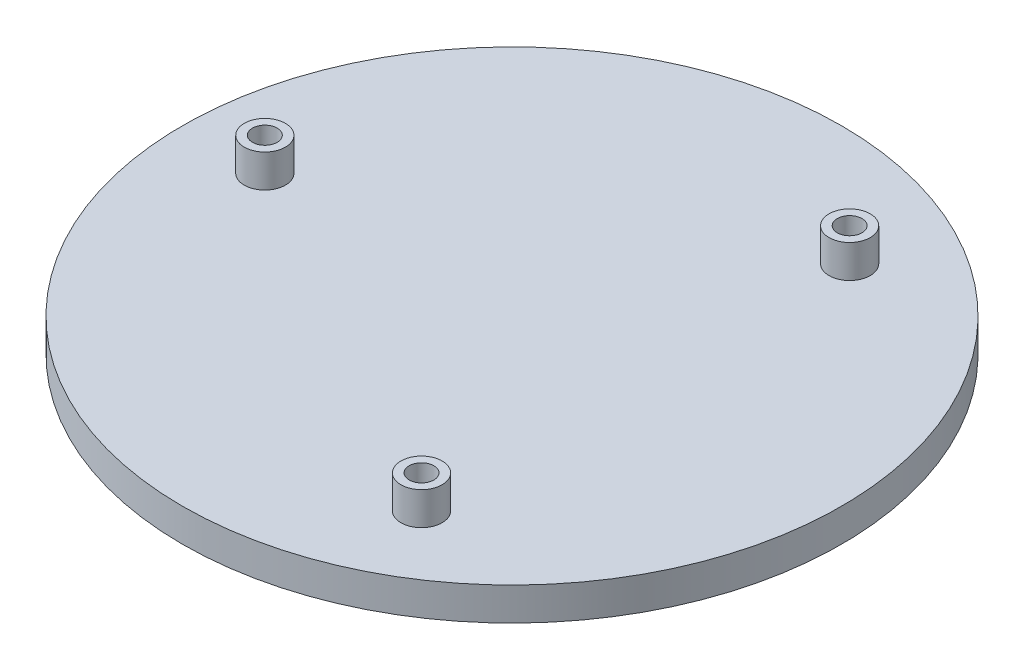
ISO-10303-21;
HEADER;
FILE_DESCRIPTION(('STEP AP214'),'2;1');
FILE_NAME('part.step','',(''),(''),'','','');
FILE_SCHEMA(('AUTOMOTIVE_DESIGN { 1 0 10303 214 1 1 1 1 }'));
ENDSEC;
DATA;
#1=APPLICATION_CONTEXT('core data for automotive mechanical design processes');
#2=APPLICATION_PROTOCOL_DEFINITION('international standard','automotive_design',2000,#1);
#3=PRODUCT_CONTEXT('',#1,'mechanical');
#4=PRODUCT('Part','Part','',(#3));
#5=PRODUCT_RELATED_PRODUCT_CATEGORY('part','',(#4));
#6=PRODUCT_DEFINITION_FORMATION('','',#4);
#7=PRODUCT_DEFINITION_CONTEXT('part definition',#1,'design');
#8=PRODUCT_DEFINITION('design','',#6,#7);
#9=PRODUCT_DEFINITION_SHAPE('','',#8);
#10=(LENGTH_UNIT() NAMED_UNIT(*) SI_UNIT(.MILLI.,.METRE.));
#11=(NAMED_UNIT(*) PLANE_ANGLE_UNIT() SI_UNIT($,.RADIAN.));
#12=(NAMED_UNIT(*) SI_UNIT($,.STERADIAN.) SOLID_ANGLE_UNIT());
#13=UNCERTAINTY_MEASURE_WITH_UNIT(LENGTH_MEASURE(1.E-05),#10,'distance_accuracy_value','');
#14=(GEOMETRIC_REPRESENTATION_CONTEXT(3) GLOBAL_UNCERTAINTY_ASSIGNED_CONTEXT((#13)) GLOBAL_UNIT_ASSIGNED_CONTEXT((#10,
#11,#12)) REPRESENTATION_CONTEXT('',''));
#15=CARTESIAN_POINT('',(0.,0.,0.));
#16=DIRECTION('',(0.,0.,1.));
#17=DIRECTION('',(1.,0.,0.));
#18=AXIS2_PLACEMENT_3D('',#15,#16,#17);
#19=CARTESIAN_POINT('',(0.,0.,0.));
#20=DIRECTION('',(0.,1.,0.));
#21=DIRECTION('',(0.,0.,1.));
#22=AXIS2_PLACEMENT_3D('',#19,#20,#21);
#23=PLANE('',#22);
#24=CARTESIAN_POINT('',(0.,0.,0.));
#25=DIRECTION('',(0.,1.,0.));
#26=DIRECTION('',(0.,0.,1.));
#27=AXIS2_PLACEMENT_3D('',#24,#25,#26);
#28=CIRCLE('',#27,50.8);
#29=CARTESIAN_POINT('',(0.,0.,50.8));
#30=VERTEX_POINT('',#29);
#31=EDGE_CURVE('E45',#30,#30,#28,.T.);
#32=ORIENTED_EDGE('',*,*,#31,.T.);
#33=EDGE_LOOP('',(#32));
#34=FACE_BOUND('',#33,.T.);
#35=CARTESIAN_POINT('',(-38.1,0.,0.));
#36=DIRECTION('',(0.,1.,0.));
#37=DIRECTION('',(0.,0.,1.));
#38=AXIS2_PLACEMENT_3D('',#35,#36,#37);
#39=CIRCLE('',#38,3.175);
#40=CARTESIAN_POINT('',(-38.1,0.,3.175));
#41=VERTEX_POINT('',#40);
#42=EDGE_CURVE('E60',#41,#41,#39,.T.);
#43=ORIENTED_EDGE('',*,*,#42,.F.);
#44=EDGE_LOOP('',(#43));
#45=FACE_BOUND('',#44,.T.);
#46=CARTESIAN_POINT('',(19.0500000000002,0.,-32.995567884187));
#47=DIRECTION('',(0.,1.,0.));
#48=DIRECTION('',(0.,0.,1.));
#49=AXIS2_PLACEMENT_3D('',#46,#47,#48);
#50=CIRCLE('',#49,3.175);
#51=CARTESIAN_POINT('',(19.0500000000002,0.,-29.820567884187));
#52=VERTEX_POINT('',#51);
#53=EDGE_CURVE('E69',#52,#52,#50,.T.);
#54=ORIENTED_EDGE('',*,*,#53,.F.);
#55=EDGE_LOOP('',(#54));
#56=FACE_BOUND('',#55,.T.);
#57=CARTESIAN_POINT('',(19.0499999999997,0.,32.9955678841873));
#58=DIRECTION('',(0.,1.,0.));
#59=DIRECTION('',(0.,0.,1.));
#60=AXIS2_PLACEMENT_3D('',#57,#58,#59);
#61=CIRCLE('',#60,3.175);
#62=CARTESIAN_POINT('',(19.0499999999997,0.,36.1705678841873));
#63=VERTEX_POINT('',#62);
#64=EDGE_CURVE('E78',#63,#63,#61,.T.);
#65=ORIENTED_EDGE('',*,*,#64,.F.);
#66=EDGE_LOOP('',(#65));
#67=FACE_BOUND('',#66,.T.);
#68=ADVANCED_FACE('F30',(#34,#45,#56,#67),#23,.T.);
#69=CARTESIAN_POINT('',(0.,-2.54000000000001,0.));
#70=DIRECTION('',(0.,-1.,0.));
#71=DIRECTION('',(0.,0.,-1.));
#72=AXIS2_PLACEMENT_3D('',#69,#70,#71);
#73=PLANE('',#72);
#74=CARTESIAN_POINT('',(0.,-2.54000000000001,0.));
#75=DIRECTION('',(0.,1.,0.));
#76=DIRECTION('',(0.,0.,1.));
#77=AXIS2_PLACEMENT_3D('',#74,#75,#76);
#78=CIRCLE('',#77,38.1);
#79=CARTESIAN_POINT('',(0.,-2.54000000000001,38.1));
#80=VERTEX_POINT('',#79);
#81=EDGE_CURVE('E56',#80,#80,#78,.T.);
#82=ORIENTED_EDGE('',*,*,#81,.F.);
#83=EDGE_LOOP('',(#82));
#84=FACE_BOUND('',#83,.T.);
#85=ADVANCED_FACE('F32',(#84),#73,.T.);
#86=CARTESIAN_POINT('',(0.,4.56768535142939,0.));
#87=DIRECTION('',(0.,1.,0.));
#88=DIRECTION('',(0.,0.,1.));
#89=AXIS2_PLACEMENT_3D('',#86,#87,#88);
#90=CYLINDRICAL_SURFACE('',#89,50.8);
#91=CARTESIAN_POINT('',(0.,-5.08000000000001,0.));
#92=DIRECTION('',(0.,1.,0.));
#93=DIRECTION('',(0.,0.,1.));
#94=AXIS2_PLACEMENT_3D('',#91,#92,#93);
#95=CIRCLE('',#94,50.8);
#96=CARTESIAN_POINT('',(0.,-5.08000000000001,50.8));
#97=VERTEX_POINT('',#96);
#98=EDGE_CURVE('E50',#97,#97,#95,.T.);
#99=ORIENTED_EDGE('',*,*,#98,.T.);
#100=EDGE_LOOP('',(#99));
#101=FACE_BOUND('',#100,.T.);
#102=ORIENTED_EDGE('',*,*,#31,.F.);
#103=EDGE_LOOP('',(#102));
#104=FACE_BOUND('',#103,.T.);
#105=ADVANCED_FACE('F111',(#101,#104),#90,.T.);
#106=CARTESIAN_POINT('',(0.,-5.08000000000001,0.));
#107=DIRECTION('',(0.,-1.,0.));
#108=DIRECTION('',(0.,0.,-1.));
#109=AXIS2_PLACEMENT_3D('',#106,#107,#108);
#110=PLANE('',#109);
#111=CARTESIAN_POINT('',(0.,-5.08000000000001,0.));
#112=DIRECTION('',(0.,1.,0.));
#113=DIRECTION('',(0.,0.,1.));
#114=AXIS2_PLACEMENT_3D('',#111,#112,#113);
#115=CIRCLE('',#114,38.1);
#116=CARTESIAN_POINT('',(0.,-5.08000000000001,38.1));
#117=VERTEX_POINT('',#116);
#118=EDGE_CURVE('E53',#117,#117,#115,.T.);
#119=ORIENTED_EDGE('',*,*,#118,.T.);
#120=EDGE_LOOP('',(#119));
#121=FACE_BOUND('',#120,.T.);
#122=ORIENTED_EDGE('',*,*,#98,.F.);
#123=EDGE_LOOP('',(#122));
#124=FACE_BOUND('',#123,.T.);
#125=ADVANCED_FACE('F147',(#121,#124),#110,.T.);
#126=CARTESIAN_POINT('',(0.,4.56768535142939,0.));
#127=DIRECTION('',(0.,1.,0.));
#128=DIRECTION('',(0.,0.,1.));
#129=AXIS2_PLACEMENT_3D('',#126,#127,#128);
#130=CYLINDRICAL_SURFACE('',#129,38.1);
#131=ORIENTED_EDGE('',*,*,#81,.T.);
#132=EDGE_LOOP('',(#131));
#133=FACE_BOUND('',#132,.T.);
#134=ORIENTED_EDGE('',*,*,#118,.F.);
#135=EDGE_LOOP('',(#134));
#136=FACE_BOUND('',#135,.T.);
#137=ADVANCED_FACE('F142',(#133,#136),#130,.F.);
#138=CARTESIAN_POINT('',(-38.1,5.08,0.));
#139=DIRECTION('',(0.,1.,0.));
#140=DIRECTION('',(0.,0.,1.));
#141=AXIS2_PLACEMENT_3D('',#138,#139,#140);
#142=PLANE('',#141);
#143=CARTESIAN_POINT('',(-38.1,5.08,0.));
#144=DIRECTION('',(0.,1.,0.));
#145=DIRECTION('',(0.,0.,1.));
#146=AXIS2_PLACEMENT_3D('',#143,#144,#145);
#147=CIRCLE('',#146,3.175);
#148=CARTESIAN_POINT('',(-38.1,5.08,3.175));
#149=VERTEX_POINT('',#148);
#150=EDGE_CURVE('E59',#149,#149,#147,.T.);
#151=ORIENTED_EDGE('',*,*,#150,.T.);
#152=EDGE_LOOP('',(#151));
#153=FACE_BOUND('',#152,.T.);
#154=CARTESIAN_POINT('',(-38.1,5.08,0.));
#155=DIRECTION('',(0.,1.,0.));
#156=DIRECTION('',(0.,0.,1.));
#157=AXIS2_PLACEMENT_3D('',#154,#155,#156);
#158=CIRCLE('',#157,1.905);
#159=CARTESIAN_POINT('',(-38.1,5.08,1.905));
#160=VERTEX_POINT('',#159);
#161=EDGE_CURVE('E63',#160,#160,#158,.T.);
#162=ORIENTED_EDGE('',*,*,#161,.F.);
#163=EDGE_LOOP('',(#162));
#164=FACE_BOUND('',#163,.T.);
#165=ADVANCED_FACE('F136',(#153,#164),#142,.T.);
#166=CARTESIAN_POINT('',(-38.1,5.08,0.));
#167=DIRECTION('',(0.,-1.,0.));
#168=DIRECTION('',(0.,0.,-1.));
#169=AXIS2_PLACEMENT_3D('',#166,#167,#168);
#170=CYLINDRICAL_SURFACE('',#169,3.175);
#171=ORIENTED_EDGE('',*,*,#150,.F.);
#172=EDGE_LOOP('',(#171));
#173=FACE_BOUND('',#172,.T.);
#174=ORIENTED_EDGE('',*,*,#42,.T.);
#175=EDGE_LOOP('',(#174));
#176=FACE_BOUND('',#175,.T.);
#177=ADVANCED_FACE('F128',(#173,#176),#170,.T.);
#178=CARTESIAN_POINT('',(-38.1,5.08,0.));
#179=DIRECTION('',(0.,-1.,0.));
#180=DIRECTION('',(0.,0.,-1.));
#181=AXIS2_PLACEMENT_3D('',#178,#179,#180);
#182=CYLINDRICAL_SURFACE('',#181,1.905);
#183=ORIENTED_EDGE('',*,*,#161,.T.);
#184=EDGE_LOOP('',(#183));
#185=FACE_BOUND('',#184,.T.);
#186=CARTESIAN_POINT('',(-38.1,0.,0.));
#187=DIRECTION('',(0.,1.,0.));
#188=DIRECTION('',(0.,0.,1.));
#189=AXIS2_PLACEMENT_3D('',#186,#187,#188);
#190=CIRCLE('',#189,1.905);
#191=CARTESIAN_POINT('',(-38.1,0.,1.905));
#192=VERTEX_POINT('',#191);
#193=EDGE_CURVE('E41',#192,#192,#190,.F.);
#194=ORIENTED_EDGE('',*,*,#193,.T.);
#195=EDGE_LOOP('',(#194));
#196=FACE_BOUND('',#195,.T.);
#197=ADVANCED_FACE('F119',(#185,#196),#182,.F.);
#198=ORIENTED_EDGE('',*,*,#193,.F.);
#199=EDGE_LOOP('',(#198));
#200=FACE_BOUND('',#199,.T.);
#201=ADVANCED_FACE('F103',(#200),#23,.T.);
#202=CARTESIAN_POINT('',(19.0500000000002,5.08,-32.995567884187));
#203=DIRECTION('',(0.,1.,0.));
#204=DIRECTION('',(0.,0.,1.));
#205=AXIS2_PLACEMENT_3D('',#202,#203,#204);
#206=PLANE('',#205);
#207=CARTESIAN_POINT('',(19.0500000000002,5.08,-32.995567884187));
#208=DIRECTION('',(0.,1.,0.));
#209=DIRECTION('',(0.,0.,1.));
#210=AXIS2_PLACEMENT_3D('',#207,#208,#209);
#211=CIRCLE('',#210,3.175);
#212=CARTESIAN_POINT('',(19.0500000000002,5.08,-29.820567884187));
#213=VERTEX_POINT('',#212);
#214=EDGE_CURVE('E68',#213,#213,#211,.T.);
#215=ORIENTED_EDGE('',*,*,#214,.T.);
#216=EDGE_LOOP('',(#215));
#217=FACE_BOUND('',#216,.T.);
#218=CARTESIAN_POINT('',(19.0500000000002,5.08,-32.995567884187));
#219=DIRECTION('',(0.,1.,0.));
#220=DIRECTION('',(0.,0.,1.));
#221=AXIS2_PLACEMENT_3D('',#218,#219,#220);
#222=CIRCLE('',#221,1.905);
#223=CARTESIAN_POINT('',(19.0500000000002,5.08,-31.090567884187));
#224=VERTEX_POINT('',#223);
#225=EDGE_CURVE('E72',#224,#224,#222,.T.);
#226=ORIENTED_EDGE('',*,*,#225,.F.);
#227=EDGE_LOOP('',(#226));
#228=FACE_BOUND('',#227,.T.);
#229=ADVANCED_FACE('F118',(#217,#228),#206,.T.);
#230=CARTESIAN_POINT('',(19.0500000000002,5.08,-32.995567884187));
#231=DIRECTION('',(0.,-1.,0.));
#232=DIRECTION('',(0.,0.,-1.));
#233=AXIS2_PLACEMENT_3D('',#230,#231,#232);
#234=CYLINDRICAL_SURFACE('',#233,3.175);
#235=ORIENTED_EDGE('',*,*,#214,.F.);
#236=EDGE_LOOP('',(#235));
#237=FACE_BOUND('',#236,.T.);
#238=ORIENTED_EDGE('',*,*,#53,.T.);
#239=EDGE_LOOP('',(#238));
#240=FACE_BOUND('',#239,.T.);
#241=ADVANCED_FACE('F125',(#237,#240),#234,.T.);
#242=CARTESIAN_POINT('',(19.0500000000002,5.08,-32.995567884187));
#243=DIRECTION('',(0.,-1.,0.));
#244=DIRECTION('',(0.,0.,-1.));
#245=AXIS2_PLACEMENT_3D('',#242,#243,#244);
#246=CYLINDRICAL_SURFACE('',#245,1.905);
#247=ORIENTED_EDGE('',*,*,#225,.T.);
#248=EDGE_LOOP('',(#247));
#249=FACE_BOUND('',#248,.T.);
#250=CARTESIAN_POINT('',(19.0500000000002,0.,-32.995567884187));
#251=DIRECTION('',(0.,1.,0.));
#252=DIRECTION('',(0.,0.,1.));
#253=AXIS2_PLACEMENT_3D('',#250,#251,#252);
#254=CIRCLE('',#253,1.905);
#255=CARTESIAN_POINT('',(19.0500000000002,0.,-31.090567884187));
#256=VERTEX_POINT('',#255);
#257=EDGE_CURVE('E37',#256,#256,#254,.F.);
#258=ORIENTED_EDGE('',*,*,#257,.T.);
#259=EDGE_LOOP('',(#258));
#260=FACE_BOUND('',#259,.T.);
#261=ADVANCED_FACE('F101',(#249,#260),#246,.F.);
#262=ORIENTED_EDGE('',*,*,#257,.F.);
#263=EDGE_LOOP('',(#262));
#264=FACE_BOUND('',#263,.T.);
#265=ADVANCED_FACE('F92',(#264),#23,.T.);
#266=CARTESIAN_POINT('',(19.0499999999997,5.08,32.9955678841873));
#267=DIRECTION('',(0.,1.,0.));
#268=DIRECTION('',(0.,0.,1.));
#269=AXIS2_PLACEMENT_3D('',#266,#267,#268);
#270=PLANE('',#269);
#271=CARTESIAN_POINT('',(19.0499999999997,5.08,32.9955678841873));
#272=DIRECTION('',(0.,1.,0.));
#273=DIRECTION('',(0.,0.,1.));
#274=AXIS2_PLACEMENT_3D('',#271,#272,#273);
#275=CIRCLE('',#274,3.175);
#276=CARTESIAN_POINT('',(19.0499999999997,5.08,36.1705678841873));
#277=VERTEX_POINT('',#276);
#278=EDGE_CURVE('E77',#277,#277,#275,.T.);
#279=ORIENTED_EDGE('',*,*,#278,.T.);
#280=EDGE_LOOP('',(#279));
#281=FACE_BOUND('',#280,.T.);
#282=CARTESIAN_POINT('',(19.0499999999997,5.08,32.9955678841873));
#283=DIRECTION('',(0.,1.,0.));
#284=DIRECTION('',(0.,0.,1.));
#285=AXIS2_PLACEMENT_3D('',#282,#283,#284);
#286=CIRCLE('',#285,1.905);
#287=CARTESIAN_POINT('',(19.0499999999997,5.08,34.9005678841873));
#288=VERTEX_POINT('',#287);
#289=EDGE_CURVE('E81',#288,#288,#286,.T.);
#290=ORIENTED_EDGE('',*,*,#289,.F.);
#291=EDGE_LOOP('',(#290));
#292=FACE_BOUND('',#291,.T.);
#293=ADVANCED_FACE('F89',(#281,#292),#270,.T.);
#294=CARTESIAN_POINT('',(19.0499999999997,5.08,32.9955678841873));
#295=DIRECTION('',(0.,-1.,0.));
#296=DIRECTION('',(0.,0.,-1.));
#297=AXIS2_PLACEMENT_3D('',#294,#295,#296);
#298=CYLINDRICAL_SURFACE('',#297,3.175);
#299=ORIENTED_EDGE('',*,*,#278,.F.);
#300=EDGE_LOOP('',(#299));
#301=FACE_BOUND('',#300,.T.);
#302=ORIENTED_EDGE('',*,*,#64,.T.);
#303=EDGE_LOOP('',(#302));
#304=FACE_BOUND('',#303,.T.);
#305=ADVANCED_FACE('F91',(#301,#304),#298,.T.);
#306=CARTESIAN_POINT('',(19.0499999999997,5.08,32.9955678841873));
#307=DIRECTION('',(0.,-1.,0.));
#308=DIRECTION('',(0.,0.,-1.));
#309=AXIS2_PLACEMENT_3D('',#306,#307,#308);
#310=CYLINDRICAL_SURFACE('',#309,1.905);
#311=ORIENTED_EDGE('',*,*,#289,.T.);
#312=EDGE_LOOP('',(#311));
#313=FACE_BOUND('',#312,.T.);
#314=CARTESIAN_POINT('',(19.0499999999997,0.,32.9955678841873));
#315=DIRECTION('',(0.,1.,0.));
#316=DIRECTION('',(0.,0.,1.));
#317=AXIS2_PLACEMENT_3D('',#314,#315,#316);
#318=CIRCLE('',#317,1.905);
#319=CARTESIAN_POINT('',(19.0499999999997,0.,34.9005678841873));
#320=VERTEX_POINT('',#319);
#321=EDGE_CURVE('E10',#320,#320,#318,.F.);
#322=ORIENTED_EDGE('',*,*,#321,.T.);
#323=EDGE_LOOP('',(#322));
#324=FACE_BOUND('',#323,.T.);
#325=ADVANCED_FACE('F87',(#313,#324),#310,.F.);
#326=ORIENTED_EDGE('',*,*,#321,.F.);
#327=EDGE_LOOP('',(#326));
#328=FACE_BOUND('',#327,.T.);
#329=ADVANCED_FACE('F104',(#328),#23,.T.);
#330=CLOSED_SHELL('',(#68,#85,#105,#125,#137,#165,#177,#197,#201,#229,#241,#261,#265,#293,#305,
#325,#329));
#331=MANIFOLD_SOLID_BREP('B2',#330);
#332=ADVANCED_BREP_SHAPE_REPRESENTATION('',(#18,#331),#14);
#333=SHAPE_DEFINITION_REPRESENTATION(#9,#332);
ENDSEC;
END-ISO-10303-21;
